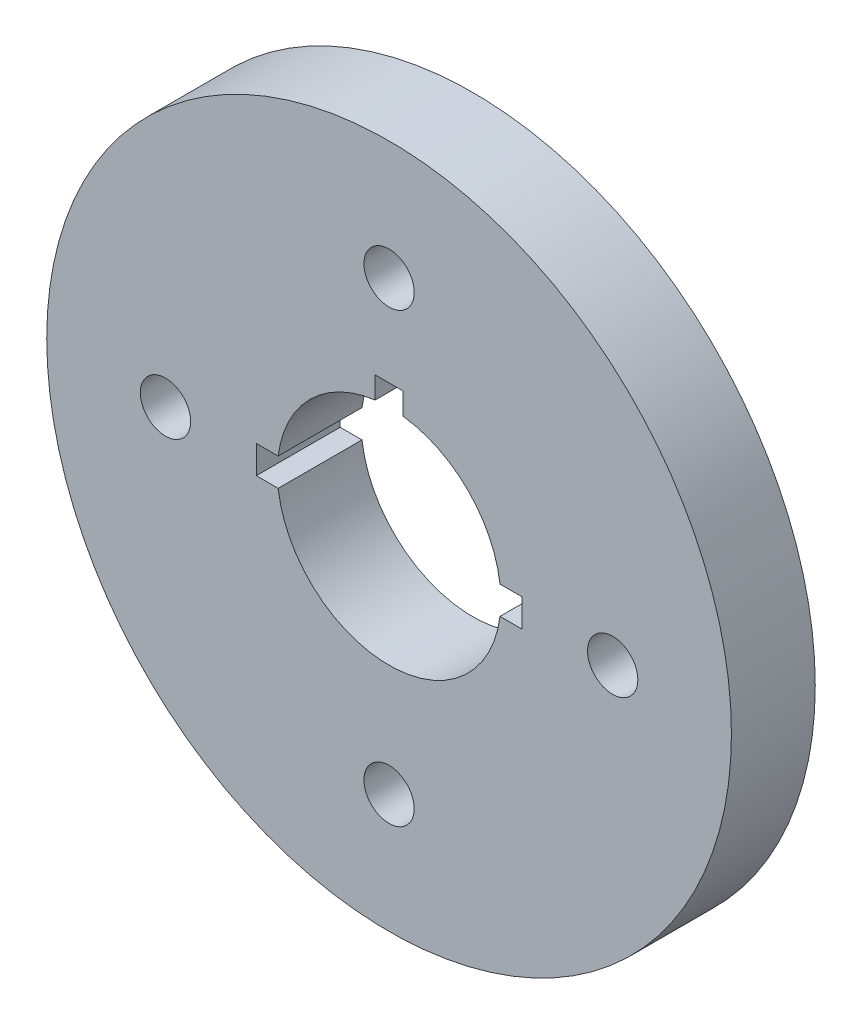
ISO-10303-21;
HEADER;
FILE_DESCRIPTION(('STEP AP214'),'2;1');
FILE_NAME('part.step','',(''),(''),'','','');
FILE_SCHEMA(('AUTOMOTIVE_DESIGN { 1 0 10303 214 1 1 1 1 }'));
ENDSEC;
DATA;
#1=APPLICATION_CONTEXT('core data for automotive mechanical design processes');
#2=APPLICATION_PROTOCOL_DEFINITION('international standard','automotive_design',2000,#1);
#3=PRODUCT_CONTEXT('',#1,'mechanical');
#4=PRODUCT('Part','Part','',(#3));
#5=PRODUCT_RELATED_PRODUCT_CATEGORY('part','',(#4));
#6=PRODUCT_DEFINITION_FORMATION('','',#4);
#7=PRODUCT_DEFINITION_CONTEXT('part definition',#1,'design');
#8=PRODUCT_DEFINITION('design','',#6,#7);
#9=PRODUCT_DEFINITION_SHAPE('','',#8);
#10=(LENGTH_UNIT() NAMED_UNIT(*) SI_UNIT(.MILLI.,.METRE.));
#11=(NAMED_UNIT(*) PLANE_ANGLE_UNIT() SI_UNIT($,.RADIAN.));
#12=(NAMED_UNIT(*) SI_UNIT($,.STERADIAN.) SOLID_ANGLE_UNIT());
#13=UNCERTAINTY_MEASURE_WITH_UNIT(LENGTH_MEASURE(1.E-05),#10,'distance_accuracy_value','');
#14=(GEOMETRIC_REPRESENTATION_CONTEXT(3) GLOBAL_UNCERTAINTY_ASSIGNED_CONTEXT((#13)) GLOBAL_UNIT_ASSIGNED_CONTEXT((#10,
#11,#12)) REPRESENTATION_CONTEXT('',''));
#15=CARTESIAN_POINT('',(0.,0.,0.));
#16=DIRECTION('',(0.,0.,1.));
#17=DIRECTION('',(1.,0.,0.));
#18=AXIS2_PLACEMENT_3D('',#15,#16,#17);
#19=CARTESIAN_POINT('',(0.,0.,3.));
#20=DIRECTION('',(0.,0.,-1.));
#21=DIRECTION('',(-1.,0.,0.));
#22=AXIS2_PLACEMENT_3D('',#19,#20,#21);
#23=CYLINDRICAL_SURFACE('',#22,4.);
#24=CARTESIAN_POINT('',(0.,0.,0.));
#25=DIRECTION('',(0.,0.,1.));
#26=DIRECTION('',(1.,0.,0.));
#27=AXIS2_PLACEMENT_3D('',#24,#25,#26);
#28=CIRCLE('',#27,4.);
#29=CARTESIAN_POINT('',(-0.5,3.96862696659689,0.));
#30=VERTEX_POINT('',#29);
#31=CARTESIAN_POINT('',(-3.96862696659689,0.5,0.));
#32=VERTEX_POINT('',#31);
#33=EDGE_CURVE('E150',#30,#32,#28,.T.);
#34=ORIENTED_EDGE('',*,*,#33,.F.);
#35=DIRECTION('',(0.,0.,1.));
#36=VECTOR('',#35,1.);
#37=CARTESIAN_POINT('',(-0.5,3.96862696659689,0.));
#38=LINE('',#37,#36);
#39=CARTESIAN_POINT('',(-0.5,3.96862696659689,3.));
#40=VERTEX_POINT('',#39);
#41=EDGE_CURVE('E160',#30,#40,#38,.T.);
#42=ORIENTED_EDGE('',*,*,#41,.T.);
#43=CARTESIAN_POINT('',(0.,0.,3.));
#44=DIRECTION('',(0.,0.,1.));
#45=DIRECTION('',(1.,0.,0.));
#46=AXIS2_PLACEMENT_3D('',#43,#44,#45);
#47=CIRCLE('',#46,4.);
#48=CARTESIAN_POINT('',(-3.96862696659689,0.5,3.));
#49=VERTEX_POINT('',#48);
#50=EDGE_CURVE('E44',#40,#49,#47,.T.);
#51=ORIENTED_EDGE('',*,*,#50,.T.);
#52=DIRECTION('',(0.,0.,1.));
#53=VECTOR('',#52,1.);
#54=CARTESIAN_POINT('',(-3.96862696659689,0.5,0.));
#55=LINE('',#54,#53);
#56=EDGE_CURVE('E195',#32,#49,#55,.T.);
#57=ORIENTED_EDGE('',*,*,#56,.F.);
#58=EDGE_LOOP('',(#34,#42,#51,#57));
#59=FACE_BOUND('',#58,.T.);
#60=ADVANCED_FACE('F35',(#59),#23,.F.);
#61=DIRECTION('',(0.,0.,1.));
#62=VECTOR('',#61,1.);
#63=CARTESIAN_POINT('',(0.5,3.96862696659689,0.));
#64=LINE('',#63,#62);
#65=CARTESIAN_POINT('',(0.5,3.96862696659689,0.));
#66=VERTEX_POINT('',#65);
#67=CARTESIAN_POINT('',(0.5,3.96862696659689,3.));
#68=VERTEX_POINT('',#67);
#69=EDGE_CURVE('E129',#66,#68,#64,.T.);
#70=ORIENTED_EDGE('',*,*,#69,.F.);
#71=CARTESIAN_POINT('',(3.96862696659689,0.5,0.));
#72=VERTEX_POINT('',#71);
#73=EDGE_CURVE('E39',#72,#66,#28,.T.);
#74=ORIENTED_EDGE('',*,*,#73,.F.);
#75=DIRECTION('',(0.,0.,1.));
#76=VECTOR('',#75,1.);
#77=CARTESIAN_POINT('',(3.96862696659689,0.5,0.));
#78=LINE('',#77,#76);
#79=CARTESIAN_POINT('',(3.96862696659689,0.5,3.));
#80=VERTEX_POINT('',#79);
#81=EDGE_CURVE('E169',#72,#80,#78,.T.);
#82=ORIENTED_EDGE('',*,*,#81,.T.);
#83=EDGE_CURVE('E11',#80,#68,#47,.T.);
#84=ORIENTED_EDGE('',*,*,#83,.T.);
#85=EDGE_LOOP('',(#70,#74,#82,#84));
#86=FACE_BOUND('',#85,.T.);
#87=ADVANCED_FACE('F139',(#86),#23,.F.);
#88=CARTESIAN_POINT('',(0.,0.,3.));
#89=DIRECTION('',(0.,0.,1.));
#90=DIRECTION('',(1.,0.,0.));
#91=AXIS2_PLACEMENT_3D('',#88,#89,#90);
#92=PLANE('',#91);
#93=CARTESIAN_POINT('',(0.,-8.,3.));
#94=DIRECTION('',(0.,0.,1.));
#95=DIRECTION('',(1.,0.,0.));
#96=AXIS2_PLACEMENT_3D('',#93,#94,#95);
#97=CIRCLE('',#96,0.9);
#98=CARTESIAN_POINT('',(0.900000000000001,-8.,3.));
#99=VERTEX_POINT('',#98);
#100=EDGE_CURVE('E241',#99,#99,#97,.T.);
#101=ORIENTED_EDGE('',*,*,#100,.F.);
#102=EDGE_LOOP('',(#101));
#103=FACE_BOUND('',#102,.T.);
#104=CARTESIAN_POINT('',(-8.,0.,3.));
#105=DIRECTION('',(0.,0.,1.));
#106=DIRECTION('',(1.,0.,0.));
#107=AXIS2_PLACEMENT_3D('',#104,#105,#106);
#108=CIRCLE('',#107,0.9);
#109=CARTESIAN_POINT('',(-7.1,0.,3.));
#110=VERTEX_POINT('',#109);
#111=EDGE_CURVE('E235',#110,#110,#108,.T.);
#112=ORIENTED_EDGE('',*,*,#111,.F.);
#113=EDGE_LOOP('',(#112));
#114=FACE_BOUND('',#113,.T.);
#115=CARTESIAN_POINT('',(0.,8.,3.));
#116=DIRECTION('',(0.,0.,1.));
#117=DIRECTION('',(1.,0.,0.));
#118=AXIS2_PLACEMENT_3D('',#115,#116,#117);
#119=CIRCLE('',#118,0.9);
#120=CARTESIAN_POINT('',(0.900000000000055,8.,3.));
#121=VERTEX_POINT('',#120);
#122=EDGE_CURVE('E229',#121,#121,#119,.T.);
#123=ORIENTED_EDGE('',*,*,#122,.F.);
#124=EDGE_LOOP('',(#123));
#125=FACE_BOUND('',#124,.T.);
#126=CARTESIAN_POINT('',(8.,0.,3.));
#127=DIRECTION('',(0.,0.,1.));
#128=DIRECTION('',(1.,0.,0.));
#129=AXIS2_PLACEMENT_3D('',#126,#127,#128);
#130=CIRCLE('',#129,0.9);
#131=CARTESIAN_POINT('',(8.9,0.,3.));
#132=VERTEX_POINT('',#131);
#133=EDGE_CURVE('E223',#132,#132,#130,.T.);
#134=ORIENTED_EDGE('',*,*,#133,.F.);
#135=EDGE_LOOP('',(#134));
#136=FACE_BOUND('',#135,.T.);
#137=CARTESIAN_POINT('',(0.,0.,3.));
#138=DIRECTION('',(0.,0.,1.));
#139=DIRECTION('',(1.,0.,0.));
#140=AXIS2_PLACEMENT_3D('',#137,#138,#139);
#141=CIRCLE('',#140,12.25);
#142=CARTESIAN_POINT('',(12.25,0.,3.));
#143=VERTEX_POINT('',#142);
#144=EDGE_CURVE('E149',#143,#143,#141,.T.);
#145=ORIENTED_EDGE('',*,*,#144,.T.);
#146=EDGE_LOOP('',(#145));
#147=FACE_BOUND('',#146,.T.);
#148=ORIENTED_EDGE('',*,*,#50,.F.);
#149=DIRECTION('',(0.,1.,0.));
#150=VECTOR('',#149,1.);
#151=CARTESIAN_POINT('',(-0.5,0.,3.));
#152=LINE('',#151,#150);
#153=CARTESIAN_POINT('',(-0.5,4.75,3.));
#154=VERTEX_POINT('',#153);
#155=EDGE_CURVE('E135',#40,#154,#152,.T.);
#156=ORIENTED_EDGE('',*,*,#155,.T.);
#157=DIRECTION('',(1.,0.,0.));
#158=VECTOR('',#157,1.);
#159=CARTESIAN_POINT('',(0.,4.75,3.));
#160=LINE('',#159,#158);
#161=CARTESIAN_POINT('',(0.5,4.75,3.));
#162=VERTEX_POINT('',#161);
#163=EDGE_CURVE('E217',#154,#162,#160,.T.);
#164=ORIENTED_EDGE('',*,*,#163,.T.);
#165=DIRECTION('',(0.,1.,0.));
#166=VECTOR('',#165,1.);
#167=CARTESIAN_POINT('',(0.5,0.,3.));
#168=LINE('',#167,#166);
#169=EDGE_CURVE('E199',#68,#162,#168,.T.);
#170=ORIENTED_EDGE('',*,*,#169,.F.);
#171=ORIENTED_EDGE('',*,*,#83,.F.);
#172=DIRECTION('',(1.,0.,0.));
#173=VECTOR('',#172,1.);
#174=CARTESIAN_POINT('',(0.,0.5,3.));
#175=LINE('',#174,#173);
#176=CARTESIAN_POINT('',(4.75,0.5,3.));
#177=VERTEX_POINT('',#176);
#178=EDGE_CURVE('E181',#80,#177,#175,.T.);
#179=ORIENTED_EDGE('',*,*,#178,.T.);
#180=DIRECTION('',(0.,-1.,0.));
#181=VECTOR('',#180,1.);
#182=CARTESIAN_POINT('',(4.75,0.,3.));
#183=LINE('',#182,#181);
#184=CARTESIAN_POINT('',(4.75,-0.5,3.));
#185=VERTEX_POINT('',#184);
#186=EDGE_CURVE('E184',#177,#185,#183,.T.);
#187=ORIENTED_EDGE('',*,*,#186,.T.);
#188=DIRECTION('',(1.,0.,0.));
#189=VECTOR('',#188,1.);
#190=CARTESIAN_POINT('',(0.,-0.5,3.));
#191=LINE('',#190,#189);
#192=CARTESIAN_POINT('',(3.96862696659689,-0.5,3.));
#193=VERTEX_POINT('',#192);
#194=EDGE_CURVE('E177',#193,#185,#191,.T.);
#195=ORIENTED_EDGE('',*,*,#194,.F.);
#196=CARTESIAN_POINT('',(-3.96862696659689,-0.5,3.));
#197=VERTEX_POINT('',#196);
#198=EDGE_CURVE('E46',#197,#193,#47,.T.);
#199=ORIENTED_EDGE('',*,*,#198,.F.);
#200=DIRECTION('',(1.,0.,0.));
#201=VECTOR('',#200,1.);
#202=CARTESIAN_POINT('',(0.,-0.5,3.));
#203=LINE('',#202,#201);
#204=CARTESIAN_POINT('',(-4.75,-0.5,3.));
#205=VERTEX_POINT('',#204);
#206=EDGE_CURVE('E204',#205,#197,#203,.T.);
#207=ORIENTED_EDGE('',*,*,#206,.F.);
#208=DIRECTION('',(0.,-1.,0.));
#209=VECTOR('',#208,1.);
#210=CARTESIAN_POINT('',(-4.75,0.,3.));
#211=LINE('',#210,#209);
#212=CARTESIAN_POINT('',(-4.75,0.5,3.));
#213=VERTEX_POINT('',#212);
#214=EDGE_CURVE('E176',#213,#205,#211,.T.);
#215=ORIENTED_EDGE('',*,*,#214,.F.);
#216=DIRECTION('',(1.,0.,0.));
#217=VECTOR('',#216,1.);
#218=CARTESIAN_POINT('',(0.,0.5,3.));
#219=LINE('',#218,#217);
#220=EDGE_CURVE('E200',#213,#49,#219,.T.);
#221=ORIENTED_EDGE('',*,*,#220,.T.);
#222=EDGE_LOOP('',(#148,#156,#164,#170,#171,#179,#187,#195,#199,#207,#215,#221));
#223=FACE_BOUND('',#222,.T.);
#224=ADVANCED_FACE('F256',(#103,#114,#125,#136,#147,#223),#92,.T.);
#225=CARTESIAN_POINT('',(0.,0.,0.));
#226=DIRECTION('',(0.,0.,1.));
#227=DIRECTION('',(1.,0.,0.));
#228=AXIS2_PLACEMENT_3D('',#225,#226,#227);
#229=PLANE('',#228);
#230=CARTESIAN_POINT('',(0.,-8.,0.));
#231=DIRECTION('',(0.,0.,1.));
#232=DIRECTION('',(1.,0.,0.));
#233=AXIS2_PLACEMENT_3D('',#230,#231,#232);
#234=CIRCLE('',#233,0.9);
#235=CARTESIAN_POINT('',(0.900000000000001,-8.,0.));
#236=VERTEX_POINT('',#235);
#237=EDGE_CURVE('E187',#236,#236,#234,.T.);
#238=ORIENTED_EDGE('',*,*,#237,.T.);
#239=EDGE_LOOP('',(#238));
#240=FACE_BOUND('',#239,.T.);
#241=CARTESIAN_POINT('',(-8.,0.,0.));
#242=DIRECTION('',(0.,0.,1.));
#243=DIRECTION('',(1.,0.,0.));
#244=AXIS2_PLACEMENT_3D('',#241,#242,#243);
#245=CIRCLE('',#244,0.9);
#246=CARTESIAN_POINT('',(-7.1,0.,0.));
#247=VERTEX_POINT('',#246);
#248=EDGE_CURVE('E238',#247,#247,#245,.T.);
#249=ORIENTED_EDGE('',*,*,#248,.T.);
#250=EDGE_LOOP('',(#249));
#251=FACE_BOUND('',#250,.T.);
#252=CARTESIAN_POINT('',(0.,8.,0.));
#253=DIRECTION('',(0.,0.,1.));
#254=DIRECTION('',(1.,0.,0.));
#255=AXIS2_PLACEMENT_3D('',#252,#253,#254);
#256=CIRCLE('',#255,0.9);
#257=CARTESIAN_POINT('',(0.900000000000055,8.,0.));
#258=VERTEX_POINT('',#257);
#259=EDGE_CURVE('E232',#258,#258,#256,.T.);
#260=ORIENTED_EDGE('',*,*,#259,.T.);
#261=EDGE_LOOP('',(#260));
#262=FACE_BOUND('',#261,.T.);
#263=CARTESIAN_POINT('',(8.,0.,0.));
#264=DIRECTION('',(0.,0.,1.));
#265=DIRECTION('',(1.,0.,0.));
#266=AXIS2_PLACEMENT_3D('',#263,#264,#265);
#267=CIRCLE('',#266,0.9);
#268=CARTESIAN_POINT('',(8.9,0.,0.));
#269=VERTEX_POINT('',#268);
#270=EDGE_CURVE('E226',#269,#269,#267,.T.);
#271=ORIENTED_EDGE('',*,*,#270,.T.);
#272=EDGE_LOOP('',(#271));
#273=FACE_BOUND('',#272,.T.);
#274=CARTESIAN_POINT('',(0.,0.,0.));
#275=DIRECTION('',(0.,0.,1.));
#276=DIRECTION('',(1.,0.,0.));
#277=AXIS2_PLACEMENT_3D('',#274,#275,#276);
#278=CIRCLE('',#277,12.25);
#279=CARTESIAN_POINT('',(12.25,0.,0.));
#280=VERTEX_POINT('',#279);
#281=EDGE_CURVE('E156',#280,#280,#278,.T.);
#282=ORIENTED_EDGE('',*,*,#281,.F.);
#283=EDGE_LOOP('',(#282));
#284=FACE_BOUND('',#283,.T.);
#285=DIRECTION('',(0.,1.,0.));
#286=VECTOR('',#285,1.);
#287=CARTESIAN_POINT('',(-0.5,0.,0.));
#288=LINE('',#287,#286);
#289=CARTESIAN_POINT('',(-0.5,4.75,0.));
#290=VERTEX_POINT('',#289);
#291=EDGE_CURVE('E142',#30,#290,#288,.T.);
#292=ORIENTED_EDGE('',*,*,#291,.F.);
#293=ORIENTED_EDGE('',*,*,#33,.T.);
#294=DIRECTION('',(1.,0.,0.));
#295=VECTOR('',#294,1.);
#296=CARTESIAN_POINT('',(0.,0.5,0.));
#297=LINE('',#296,#295);
#298=CARTESIAN_POINT('',(-4.75,0.5,0.));
#299=VERTEX_POINT('',#298);
#300=EDGE_CURVE('E193',#299,#32,#297,.T.);
#301=ORIENTED_EDGE('',*,*,#300,.F.);
#302=DIRECTION('',(0.,-1.,0.));
#303=VECTOR('',#302,1.);
#304=CARTESIAN_POINT('',(-4.75,0.,0.));
#305=LINE('',#304,#303);
#306=CARTESIAN_POINT('',(-4.75,-0.5,0.));
#307=VERTEX_POINT('',#306);
#308=EDGE_CURVE('E203',#299,#307,#305,.T.);
#309=ORIENTED_EDGE('',*,*,#308,.T.);
#310=DIRECTION('',(1.,0.,0.));
#311=VECTOR('',#310,1.);
#312=CARTESIAN_POINT('',(0.,-0.5,0.));
#313=LINE('',#312,#311);
#314=CARTESIAN_POINT('',(-3.96862696659689,-0.5,0.));
#315=VERTEX_POINT('',#314);
#316=EDGE_CURVE('E209',#307,#315,#313,.T.);
#317=ORIENTED_EDGE('',*,*,#316,.T.);
#318=CARTESIAN_POINT('',(3.96862696659689,-0.5,0.));
#319=VERTEX_POINT('',#318);
#320=EDGE_CURVE('E151',#315,#319,#28,.T.);
#321=ORIENTED_EDGE('',*,*,#320,.T.);
#322=DIRECTION('',(1.,0.,0.));
#323=VECTOR('',#322,1.);
#324=CARTESIAN_POINT('',(0.,-0.5,0.));
#325=LINE('',#324,#323);
#326=CARTESIAN_POINT('',(4.75,-0.5,0.));
#327=VERTEX_POINT('',#326);
#328=EDGE_CURVE('E170',#319,#327,#325,.T.);
#329=ORIENTED_EDGE('',*,*,#328,.T.);
#330=DIRECTION('',(0.,-1.,0.));
#331=VECTOR('',#330,1.);
#332=CARTESIAN_POINT('',(4.75,0.,0.));
#333=LINE('',#332,#331);
#334=CARTESIAN_POINT('',(4.75,0.5,0.));
#335=VERTEX_POINT('',#334);
#336=EDGE_CURVE('E180',#335,#327,#333,.T.);
#337=ORIENTED_EDGE('',*,*,#336,.F.);
#338=DIRECTION('',(1.,0.,0.));
#339=VECTOR('',#338,1.);
#340=CARTESIAN_POINT('',(0.,0.5,0.));
#341=LINE('',#340,#339);
#342=EDGE_CURVE('E148',#72,#335,#341,.T.);
#343=ORIENTED_EDGE('',*,*,#342,.F.);
#344=ORIENTED_EDGE('',*,*,#73,.T.);
#345=DIRECTION('',(0.,1.,0.));
#346=VECTOR('',#345,1.);
#347=CARTESIAN_POINT('',(0.5,0.,0.));
#348=LINE('',#347,#346);
#349=CARTESIAN_POINT('',(0.5,4.75,0.));
#350=VERTEX_POINT('',#349);
#351=EDGE_CURVE('E126',#66,#350,#348,.T.);
#352=ORIENTED_EDGE('',*,*,#351,.T.);
#353=DIRECTION('',(1.,0.,0.));
#354=VECTOR('',#353,1.);
#355=CARTESIAN_POINT('',(0.,4.75,0.));
#356=LINE('',#355,#354);
#357=EDGE_CURVE('E134',#290,#350,#356,.T.);
#358=ORIENTED_EDGE('',*,*,#357,.F.);
#359=EDGE_LOOP('',(#292,#293,#301,#309,#317,#321,#329,#337,#343,#344,#352,#358));
#360=FACE_BOUND('',#359,.T.);
#361=ADVANCED_FACE('F146',(#240,#251,#262,#273,#284,#360),#229,.F.);
#362=CARTESIAN_POINT('',(0.,0.,3.));
#363=DIRECTION('',(0.,0.,-1.));
#364=DIRECTION('',(-1.,0.,0.));
#365=AXIS2_PLACEMENT_3D('',#362,#363,#364);
#366=CYLINDRICAL_SURFACE('',#365,12.25);
#367=ORIENTED_EDGE('',*,*,#144,.F.);
#368=EDGE_LOOP('',(#367));
#369=FACE_BOUND('',#368,.T.);
#370=ORIENTED_EDGE('',*,*,#281,.T.);
#371=EDGE_LOOP('',(#370));
#372=FACE_BOUND('',#371,.T.);
#373=ADVANCED_FACE('F37',(#369,#372),#366,.T.);
#374=DIRECTION('',(0.,0.,1.));
#375=VECTOR('',#374,1.);
#376=CARTESIAN_POINT('',(-3.96862696659689,-0.5,0.));
#377=LINE('',#376,#375);
#378=EDGE_CURVE('E61',#315,#197,#377,.T.);
#379=ORIENTED_EDGE('',*,*,#378,.T.);
#380=ORIENTED_EDGE('',*,*,#198,.T.);
#381=DIRECTION('',(0.,0.,1.));
#382=VECTOR('',#381,1.);
#383=CARTESIAN_POINT('',(3.96862696659689,-0.5,0.));
#384=LINE('',#383,#382);
#385=EDGE_CURVE('E172',#319,#193,#384,.T.);
#386=ORIENTED_EDGE('',*,*,#385,.F.);
#387=ORIENTED_EDGE('',*,*,#320,.F.);
#388=EDGE_LOOP('',(#379,#380,#386,#387));
#389=FACE_BOUND('',#388,.T.);
#390=ADVANCED_FACE('F278',(#389),#23,.F.);
#391=CARTESIAN_POINT('',(4.75,0.,0.));
#392=DIRECTION('',(-1.,0.,0.));
#393=DIRECTION('',(0.,0.,1.));
#394=AXIS2_PLACEMENT_3D('',#391,#392,#393);
#395=PLANE('',#394);
#396=ORIENTED_EDGE('',*,*,#186,.F.);
#397=DIRECTION('',(0.,0.,1.));
#398=VECTOR('',#397,1.);
#399=CARTESIAN_POINT('',(4.75,0.5,0.));
#400=LINE('',#399,#398);
#401=EDGE_CURVE('E167',#335,#177,#400,.T.);
#402=ORIENTED_EDGE('',*,*,#401,.F.);
#403=ORIENTED_EDGE('',*,*,#336,.T.);
#404=DIRECTION('',(0.,0.,1.));
#405=VECTOR('',#404,1.);
#406=CARTESIAN_POINT('',(4.75,-0.5,0.));
#407=LINE('',#406,#405);
#408=EDGE_CURVE('E174',#327,#185,#407,.T.);
#409=ORIENTED_EDGE('',*,*,#408,.T.);
#410=EDGE_LOOP('',(#396,#402,#403,#409));
#411=FACE_BOUND('',#410,.T.);
#412=ADVANCED_FACE('F287',(#411),#395,.T.);
#413=CARTESIAN_POINT('',(0.,-0.5,0.));
#414=DIRECTION('',(0.,-1.,0.));
#415=DIRECTION('',(0.,0.,-1.));
#416=AXIS2_PLACEMENT_3D('',#413,#414,#415);
#417=PLANE('',#416);
#418=ORIENTED_EDGE('',*,*,#194,.T.);
#419=ORIENTED_EDGE('',*,*,#408,.F.);
#420=ORIENTED_EDGE('',*,*,#328,.F.);
#421=ORIENTED_EDGE('',*,*,#385,.T.);
#422=EDGE_LOOP('',(#418,#419,#420,#421));
#423=FACE_BOUND('',#422,.T.);
#424=ADVANCED_FACE('F284',(#423),#417,.F.);
#425=CARTESIAN_POINT('',(0.,0.5,0.));
#426=DIRECTION('',(0.,-1.,0.));
#427=DIRECTION('',(0.,0.,-1.));
#428=AXIS2_PLACEMENT_3D('',#425,#426,#427);
#429=PLANE('',#428);
#430=ORIENTED_EDGE('',*,*,#178,.F.);
#431=ORIENTED_EDGE('',*,*,#81,.F.);
#432=ORIENTED_EDGE('',*,*,#342,.T.);
#433=ORIENTED_EDGE('',*,*,#401,.T.);
#434=EDGE_LOOP('',(#430,#431,#432,#433));
#435=FACE_BOUND('',#434,.T.);
#436=ADVANCED_FACE('F289',(#435),#429,.T.);
#437=CARTESIAN_POINT('',(-4.75,0.,0.));
#438=DIRECTION('',(-1.,0.,0.));
#439=DIRECTION('',(0.,0.,1.));
#440=AXIS2_PLACEMENT_3D('',#437,#438,#439);
#441=PLANE('',#440);
#442=ORIENTED_EDGE('',*,*,#214,.T.);
#443=DIRECTION('',(0.,0.,1.));
#444=VECTOR('',#443,1.);
#445=CARTESIAN_POINT('',(-4.75,-0.5,0.));
#446=LINE('',#445,#444);
#447=EDGE_CURVE('E191',#307,#205,#446,.T.);
#448=ORIENTED_EDGE('',*,*,#447,.F.);
#449=ORIENTED_EDGE('',*,*,#308,.F.);
#450=DIRECTION('',(0.,0.,1.));
#451=VECTOR('',#450,1.);
#452=CARTESIAN_POINT('',(-4.75,0.5,0.));
#453=LINE('',#452,#451);
#454=EDGE_CURVE('E197',#299,#213,#453,.T.);
#455=ORIENTED_EDGE('',*,*,#454,.T.);
#456=EDGE_LOOP('',(#442,#448,#449,#455));
#457=FACE_BOUND('',#456,.T.);
#458=ADVANCED_FACE('F301',(#457),#441,.F.);
#459=CARTESIAN_POINT('',(0.,0.5,0.));
#460=DIRECTION('',(0.,-1.,0.));
#461=DIRECTION('',(0.,0.,-1.));
#462=AXIS2_PLACEMENT_3D('',#459,#460,#461);
#463=PLANE('',#462);
#464=ORIENTED_EDGE('',*,*,#220,.F.);
#465=ORIENTED_EDGE('',*,*,#454,.F.);
#466=ORIENTED_EDGE('',*,*,#300,.T.);
#467=ORIENTED_EDGE('',*,*,#56,.T.);
#468=EDGE_LOOP('',(#464,#465,#466,#467));
#469=FACE_BOUND('',#468,.T.);
#470=ADVANCED_FACE('F298',(#469),#463,.T.);
#471=CARTESIAN_POINT('',(0.,-0.5,0.));
#472=DIRECTION('',(0.,-1.,0.));
#473=DIRECTION('',(0.,0.,-1.));
#474=AXIS2_PLACEMENT_3D('',#471,#472,#473);
#475=PLANE('',#474);
#476=ORIENTED_EDGE('',*,*,#206,.T.);
#477=ORIENTED_EDGE('',*,*,#378,.F.);
#478=ORIENTED_EDGE('',*,*,#316,.F.);
#479=ORIENTED_EDGE('',*,*,#447,.T.);
#480=EDGE_LOOP('',(#476,#477,#478,#479));
#481=FACE_BOUND('',#480,.T.);
#482=ADVANCED_FACE('F302',(#481),#475,.F.);
#483=CARTESIAN_POINT('',(-0.5,0.,0.));
#484=DIRECTION('',(1.,0.,0.));
#485=DIRECTION('',(0.,1.,0.));
#486=AXIS2_PLACEMENT_3D('',#483,#484,#485);
#487=PLANE('',#486);
#488=ORIENTED_EDGE('',*,*,#155,.F.);
#489=ORIENTED_EDGE('',*,*,#41,.F.);
#490=ORIENTED_EDGE('',*,*,#291,.T.);
#491=DIRECTION('',(0.,0.,1.));
#492=VECTOR('',#491,1.);
#493=CARTESIAN_POINT('',(-0.5,4.75,0.));
#494=LINE('',#493,#492);
#495=EDGE_CURVE('E164',#290,#154,#494,.T.);
#496=ORIENTED_EDGE('',*,*,#495,.T.);
#497=EDGE_LOOP('',(#488,#489,#490,#496));
#498=FACE_BOUND('',#497,.T.);
#499=ADVANCED_FACE('F304',(#498),#487,.T.);
#500=CARTESIAN_POINT('',(0.,4.75,0.));
#501=DIRECTION('',(0.,-1.,0.));
#502=DIRECTION('',(1.,0.,0.));
#503=AXIS2_PLACEMENT_3D('',#500,#501,#502);
#504=PLANE('',#503);
#505=ORIENTED_EDGE('',*,*,#163,.F.);
#506=ORIENTED_EDGE('',*,*,#495,.F.);
#507=ORIENTED_EDGE('',*,*,#357,.T.);
#508=DIRECTION('',(0.,0.,1.));
#509=VECTOR('',#508,1.);
#510=CARTESIAN_POINT('',(0.5,4.75,0.));
#511=LINE('',#510,#509);
#512=EDGE_CURVE('E53',#350,#162,#511,.T.);
#513=ORIENTED_EDGE('',*,*,#512,.T.);
#514=EDGE_LOOP('',(#505,#506,#507,#513));
#515=FACE_BOUND('',#514,.T.);
#516=ADVANCED_FACE('F293',(#515),#504,.T.);
#517=CARTESIAN_POINT('',(0.5,0.,0.));
#518=DIRECTION('',(1.,0.,0.));
#519=DIRECTION('',(0.,1.,0.));
#520=AXIS2_PLACEMENT_3D('',#517,#518,#519);
#521=PLANE('',#520);
#522=ORIENTED_EDGE('',*,*,#169,.T.);
#523=ORIENTED_EDGE('',*,*,#512,.F.);
#524=ORIENTED_EDGE('',*,*,#351,.F.);
#525=ORIENTED_EDGE('',*,*,#69,.T.);
#526=EDGE_LOOP('',(#522,#523,#524,#525));
#527=FACE_BOUND('',#526,.T.);
#528=ADVANCED_FACE('F128',(#527),#521,.F.);
#529=CARTESIAN_POINT('',(8.,0.,0.));
#530=DIRECTION('',(0.,0.,1.));
#531=DIRECTION('',(1.,0.,0.));
#532=AXIS2_PLACEMENT_3D('',#529,#530,#531);
#533=CYLINDRICAL_SURFACE('',#532,0.9);
#534=ORIENTED_EDGE('',*,*,#270,.F.);
#535=EDGE_LOOP('',(#534));
#536=FACE_BOUND('',#535,.T.);
#537=ORIENTED_EDGE('',*,*,#133,.T.);
#538=EDGE_LOOP('',(#537));
#539=FACE_BOUND('',#538,.T.);
#540=ADVANCED_FACE('F370',(#536,#539),#533,.F.);
#541=CARTESIAN_POINT('',(0.,8.,0.));
#542=DIRECTION('',(0.,0.,1.));
#543=DIRECTION('',(1.,0.,0.));
#544=AXIS2_PLACEMENT_3D('',#541,#542,#543);
#545=CYLINDRICAL_SURFACE('',#544,0.9);
#546=ORIENTED_EDGE('',*,*,#259,.F.);
#547=EDGE_LOOP('',(#546));
#548=FACE_BOUND('',#547,.T.);
#549=ORIENTED_EDGE('',*,*,#122,.T.);
#550=EDGE_LOOP('',(#549));
#551=FACE_BOUND('',#550,.T.);
#552=ADVANCED_FACE('F392',(#548,#551),#545,.F.);
#553=CARTESIAN_POINT('',(-8.,0.,0.));
#554=DIRECTION('',(0.,0.,1.));
#555=DIRECTION('',(1.,0.,0.));
#556=AXIS2_PLACEMENT_3D('',#553,#554,#555);
#557=CYLINDRICAL_SURFACE('',#556,0.9);
#558=ORIENTED_EDGE('',*,*,#248,.F.);
#559=EDGE_LOOP('',(#558));
#560=FACE_BOUND('',#559,.T.);
#561=ORIENTED_EDGE('',*,*,#111,.T.);
#562=EDGE_LOOP('',(#561));
#563=FACE_BOUND('',#562,.T.);
#564=ADVANCED_FACE('F252',(#560,#563),#557,.F.);
#565=CARTESIAN_POINT('',(0.,-8.,0.));
#566=DIRECTION('',(0.,0.,1.));
#567=DIRECTION('',(1.,0.,0.));
#568=AXIS2_PLACEMENT_3D('',#565,#566,#567);
#569=CYLINDRICAL_SURFACE('',#568,0.9);
#570=ORIENTED_EDGE('',*,*,#237,.F.);
#571=EDGE_LOOP('',(#570));
#572=FACE_BOUND('',#571,.T.);
#573=ORIENTED_EDGE('',*,*,#100,.T.);
#574=EDGE_LOOP('',(#573));
#575=FACE_BOUND('',#574,.T.);
#576=ADVANCED_FACE('F249',(#572,#575),#569,.F.);
#577=CLOSED_SHELL('',(#60,#87,#224,#361,#373,#390,#412,#424,#436,#458,#470,#482,#499,#516,#528,
#540,#552,#564,#576));
#578=MANIFOLD_SOLID_BREP('B2',#577);
#579=ADVANCED_BREP_SHAPE_REPRESENTATION('',(#18,#578),#14);
#580=SHAPE_DEFINITION_REPRESENTATION(#9,#579);
ENDSEC;
END-ISO-10303-21;
